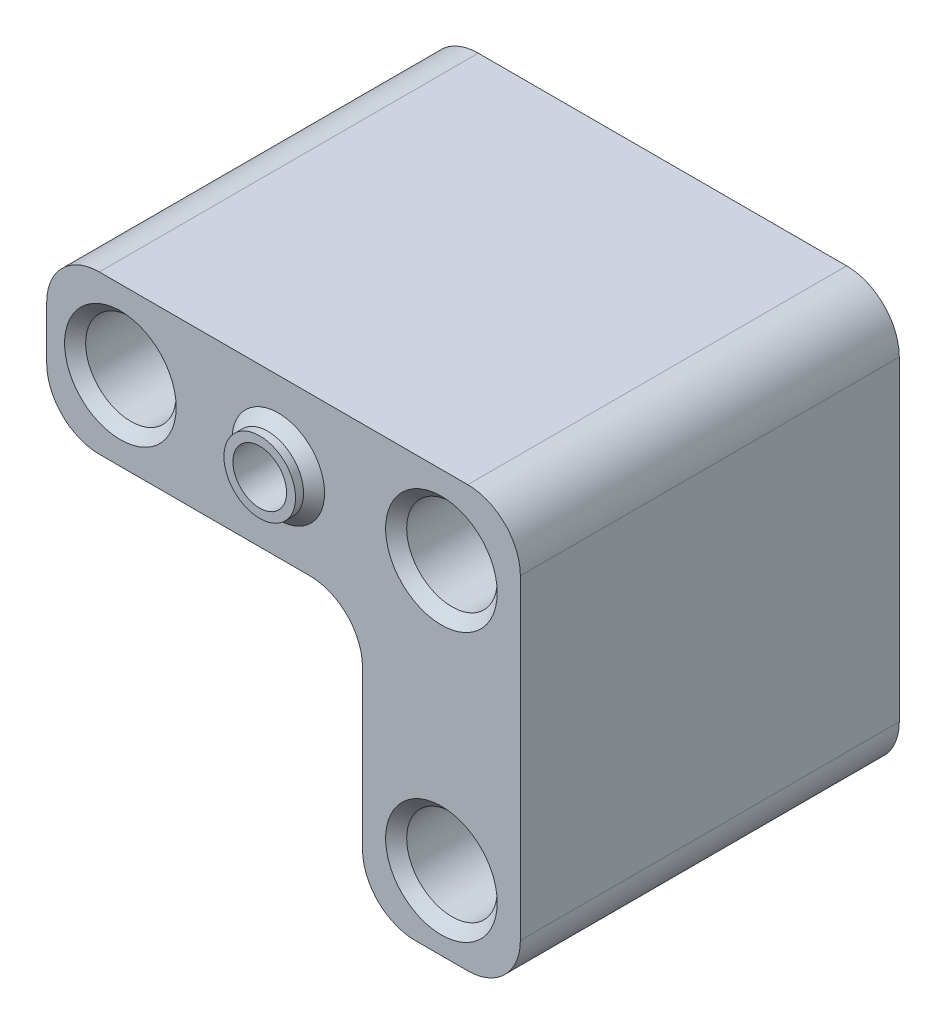
ISO-10303-21;
HEADER;
FILE_DESCRIPTION(('STEP AP214'),'2;1');
FILE_NAME('part.step','',(''),(''),'','','');
FILE_SCHEMA(('AUTOMOTIVE_DESIGN { 1 0 10303 214 1 1 1 1 }'));
ENDSEC;
DATA;
#1=APPLICATION_CONTEXT('core data for automotive mechanical design processes');
#2=APPLICATION_PROTOCOL_DEFINITION('international standard','automotive_design',2000,#1);
#3=PRODUCT_CONTEXT('',#1,'mechanical');
#4=PRODUCT('Part','Part','',(#3));
#5=PRODUCT_RELATED_PRODUCT_CATEGORY('part','',(#4));
#6=PRODUCT_DEFINITION_FORMATION('','',#4);
#7=PRODUCT_DEFINITION_CONTEXT('part definition',#1,'design');
#8=PRODUCT_DEFINITION('design','',#6,#7);
#9=PRODUCT_DEFINITION_SHAPE('','',#8);
#10=(LENGTH_UNIT() NAMED_UNIT(*) SI_UNIT(.MILLI.,.METRE.));
#11=(NAMED_UNIT(*) PLANE_ANGLE_UNIT() SI_UNIT($,.RADIAN.));
#12=(NAMED_UNIT(*) SI_UNIT($,.STERADIAN.) SOLID_ANGLE_UNIT());
#13=UNCERTAINTY_MEASURE_WITH_UNIT(LENGTH_MEASURE(1.E-05),#10,'distance_accuracy_value','');
#14=(GEOMETRIC_REPRESENTATION_CONTEXT(3) GLOBAL_UNCERTAINTY_ASSIGNED_CONTEXT((#13)) GLOBAL_UNIT_ASSIGNED_CONTEXT((#10,
#11,#12)) REPRESENTATION_CONTEXT('',''));
#15=CARTESIAN_POINT('',(0.,0.,0.));
#16=DIRECTION('',(0.,0.,1.));
#17=DIRECTION('',(1.,0.,0.));
#18=AXIS2_PLACEMENT_3D('',#15,#16,#17);
#19=CARTESIAN_POINT('',(-653.,0.,36.));
#20=DIRECTION('',(0.,0.,-1.));
#21=DIRECTION('',(1.,0.,0.));
#22=AXIS2_PLACEMENT_3D('',#19,#20,#21);
#23=PLANE('',#22);
#24=CARTESIAN_POINT('',(-349.5,352.5,36.));
#25=DIRECTION('',(0.,0.,1.));
#26=DIRECTION('',(1.,0.,0.));
#27=AXIS2_PLACEMENT_3D('',#24,#25,#26);
#28=CIRCLE('',#27,4.40000000000001);
#29=CARTESIAN_POINT('',(-345.1,352.5,36.));
#30=VERTEX_POINT('',#29);
#31=EDGE_CURVE('E538',#30,#30,#28,.T.);
#32=ORIENTED_EDGE('',*,*,#31,.F.);
#33=EDGE_LOOP('',(#32));
#34=FACE_BOUND('',#33,.T.);
#35=DIRECTION('',(0.,-1.,0.));
#36=VECTOR('',#35,1.);
#37=CARTESIAN_POINT('',(-371.5,360.,36.));
#38=LINE('',#37,#36);
#39=CARTESIAN_POINT('',(-371.5,355.,36.));
#40=VERTEX_POINT('',#39);
#41=CARTESIAN_POINT('',(-371.5,350.,36.));
#42=VERTEX_POINT('',#41);
#43=EDGE_CURVE('E403',#40,#42,#38,.T.);
#44=ORIENTED_EDGE('',*,*,#43,.T.);
#45=CARTESIAN_POINT('',(-366.5,350.,36.));
#46=DIRECTION('',(0.,0.,1.));
#47=DIRECTION('',(1.,0.,0.));
#48=AXIS2_PLACEMENT_3D('',#45,#46,#47);
#49=CIRCLE('',#48,5.);
#50=CARTESIAN_POINT('',(-366.5,345.,36.));
#51=VERTEX_POINT('',#50);
#52=EDGE_CURVE('E470',#51,#42,#49,.F.);
#53=ORIENTED_EDGE('',*,*,#52,.F.);
#54=DIRECTION('',(-1.,0.,0.));
#55=VECTOR('',#54,1.);
#56=CARTESIAN_POINT('',(-341.5,345.,36.));
#57=LINE('',#56,#55);
#58=CARTESIAN_POINT('',(-346.5,345.,36.));
#59=VERTEX_POINT('',#58);
#60=EDGE_CURVE('E360',#59,#51,#57,.T.);
#61=ORIENTED_EDGE('',*,*,#60,.F.);
#62=CARTESIAN_POINT('',(-346.5,340.,36.));
#63=DIRECTION('',(0.,0.,1.));
#64=DIRECTION('',(1.,0.,0.));
#65=AXIS2_PLACEMENT_3D('',#62,#63,#64);
#66=CIRCLE('',#65,5.);
#67=CARTESIAN_POINT('',(-341.5,340.,36.));
#68=VERTEX_POINT('',#67);
#69=EDGE_CURVE('E506',#68,#59,#66,.T.);
#70=ORIENTED_EDGE('',*,*,#69,.F.);
#71=DIRECTION('',(0.,1.,0.));
#72=VECTOR('',#71,1.);
#73=CARTESIAN_POINT('',(-341.5,320.,36.));
#74=LINE('',#73,#72);
#75=CARTESIAN_POINT('',(-341.5,325.,36.));
#76=VERTEX_POINT('',#75);
#77=EDGE_CURVE('E378',#76,#68,#74,.T.);
#78=ORIENTED_EDGE('',*,*,#77,.F.);
#79=CARTESIAN_POINT('',(-336.5,325.,36.));
#80=DIRECTION('',(0.,0.,1.));
#81=DIRECTION('',(1.,0.,0.));
#82=AXIS2_PLACEMENT_3D('',#79,#80,#81);
#83=CIRCLE('',#82,5.);
#84=CARTESIAN_POINT('',(-336.5,320.,36.));
#85=VERTEX_POINT('',#84);
#86=EDGE_CURVE('E466',#85,#76,#83,.F.);
#87=ORIENTED_EDGE('',*,*,#86,.F.);
#88=DIRECTION('',(1.,0.,0.));
#89=VECTOR('',#88,1.);
#90=CARTESIAN_POINT('',(-341.5,320.,36.));
#91=LINE('',#90,#89);
#92=CARTESIAN_POINT('',(-331.5,320.,36.));
#93=VERTEX_POINT('',#92);
#94=EDGE_CURVE('E374',#85,#93,#91,.T.);
#95=ORIENTED_EDGE('',*,*,#94,.T.);
#96=CARTESIAN_POINT('',(-331.5,325.,36.));
#97=DIRECTION('',(0.,0.,1.));
#98=DIRECTION('',(1.,0.,0.));
#99=AXIS2_PLACEMENT_3D('',#96,#97,#98);
#100=CIRCLE('',#99,5.);
#101=CARTESIAN_POINT('',(-326.5,325.,36.));
#102=VERTEX_POINT('',#101);
#103=EDGE_CURVE('E462',#102,#93,#100,.F.);
#104=ORIENTED_EDGE('',*,*,#103,.F.);
#105=DIRECTION('',(0.,1.,0.));
#106=VECTOR('',#105,1.);
#107=CARTESIAN_POINT('',(-326.5,320.,36.));
#108=LINE('',#107,#106);
#109=CARTESIAN_POINT('',(-326.5,355.,36.));
#110=VERTEX_POINT('',#109);
#111=EDGE_CURVE('E369',#102,#110,#108,.T.);
#112=ORIENTED_EDGE('',*,*,#111,.T.);
#113=CARTESIAN_POINT('',(-331.5,355.,36.));
#114=DIRECTION('',(0.,0.,1.));
#115=DIRECTION('',(1.,0.,0.));
#116=AXIS2_PLACEMENT_3D('',#113,#114,#115);
#117=CIRCLE('',#116,5.);
#118=CARTESIAN_POINT('',(-331.5,360.,36.));
#119=VERTEX_POINT('',#118);
#120=EDGE_CURVE('E458',#119,#110,#117,.F.);
#121=ORIENTED_EDGE('',*,*,#120,.F.);
#122=DIRECTION('',(1.,0.,0.));
#123=VECTOR('',#122,1.);
#124=CARTESIAN_POINT('',(-341.5,360.,36.));
#125=LINE('',#124,#123);
#126=CARTESIAN_POINT('',(-366.5,360.,36.));
#127=VERTEX_POINT('',#126);
#128=EDGE_CURVE('E365',#127,#119,#125,.T.);
#129=ORIENTED_EDGE('',*,*,#128,.F.);
#130=CARTESIAN_POINT('',(-366.5,355.,36.));
#131=DIRECTION('',(0.,0.,1.));
#132=DIRECTION('',(1.,0.,0.));
#133=AXIS2_PLACEMENT_3D('',#130,#131,#132);
#134=CIRCLE('',#133,5.);
#135=EDGE_CURVE('E474',#40,#127,#134,.F.);
#136=ORIENTED_EDGE('',*,*,#135,.F.);
#137=EDGE_LOOP('',(#44,#53,#61,#70,#78,#87,#95,#104,#112,#121,#129,#136));
#138=FACE_BOUND('',#137,.T.);
#139=CARTESIAN_POINT('',(-334.,327.,36.));
#140=DIRECTION('',(0.,0.,1.));
#141=DIRECTION('',(1.,0.,0.));
#142=AXIS2_PLACEMENT_3D('',#139,#140,#141);
#143=CIRCLE('',#142,5.30000000000003);
#144=CARTESIAN_POINT('',(-328.7,327.,36.));
#145=VERTEX_POINT('',#144);
#146=EDGE_CURVE('E514',#145,#145,#143,.T.);
#147=ORIENTED_EDGE('',*,*,#146,.F.);
#148=EDGE_LOOP('',(#147));
#149=FACE_BOUND('',#148,.T.);
#150=CARTESIAN_POINT('',(-334.,352.5,36.));
#151=DIRECTION('',(0.,0.,1.));
#152=DIRECTION('',(1.,0.,0.));
#153=AXIS2_PLACEMENT_3D('',#150,#151,#152);
#154=CIRCLE('',#153,5.30000000000003);
#155=CARTESIAN_POINT('',(-328.7,352.5,36.));
#156=VERTEX_POINT('',#155);
#157=EDGE_CURVE('E518',#156,#156,#154,.T.);
#158=ORIENTED_EDGE('',*,*,#157,.F.);
#159=EDGE_LOOP('',(#158));
#160=FACE_BOUND('',#159,.T.);
#161=CARTESIAN_POINT('',(-364.5,352.5,36.));
#162=DIRECTION('',(0.,0.,1.));
#163=DIRECTION('',(1.,0.,0.));
#164=AXIS2_PLACEMENT_3D('',#161,#162,#163);
#165=CIRCLE('',#164,5.30000000000003);
#166=CARTESIAN_POINT('',(-359.2,352.5,36.));
#167=VERTEX_POINT('',#166);
#168=EDGE_CURVE('E522',#167,#167,#165,.T.);
#169=ORIENTED_EDGE('',*,*,#168,.F.);
#170=EDGE_LOOP('',(#169));
#171=FACE_BOUND('',#170,.T.);
#172=ADVANCED_FACE('F137',(#34,#138,#149,#160,#171),#23,.F.);
#173=CARTESIAN_POINT('',(-334.,352.5,36.));
#174=DIRECTION('',(0.,0.,-1.));
#175=DIRECTION('',(1.,0.,0.));
#176=AXIS2_PLACEMENT_3D('',#173,#174,#175);
#177=CYLINDRICAL_SURFACE('',#176,2.55);
#178=CARTESIAN_POINT('',(-334.,352.5,0.));
#179=DIRECTION('',(0.,0.,-1.));
#180=DIRECTION('',(-1.,0.,0.));
#181=AXIS2_PLACEMENT_3D('',#178,#179,#180);
#182=CIRCLE('',#181,2.55);
#183=CARTESIAN_POINT('',(-336.55,352.5,0.));
#184=VERTEX_POINT('',#183);
#185=EDGE_CURVE('E359',#184,#184,#182,.T.);
#186=ORIENTED_EDGE('',*,*,#185,.T.);
#187=EDGE_LOOP('',(#186));
#188=FACE_BOUND('',#187,.T.);
#189=CARTESIAN_POINT('',(-334.,352.5,5.4));
#190=DIRECTION('',(0.,0.,-1.));
#191=DIRECTION('',(-1.,0.,0.));
#192=AXIS2_PLACEMENT_3D('',#189,#190,#191);
#193=CIRCLE('',#192,2.55);
#194=CARTESIAN_POINT('',(-336.55,352.5,5.4));
#195=VERTEX_POINT('',#194);
#196=EDGE_CURVE('E402',#195,#195,#193,.T.);
#197=ORIENTED_EDGE('',*,*,#196,.F.);
#198=EDGE_LOOP('',(#197));
#199=FACE_BOUND('',#198,.T.);
#200=ADVANCED_FACE('F632',(#188,#199),#177,.F.);
#201=CARTESIAN_POINT('',(-334.,327.,36.));
#202=DIRECTION('',(0.,0.,-1.));
#203=DIRECTION('',(1.,0.,0.));
#204=AXIS2_PLACEMENT_3D('',#201,#202,#203);
#205=CYLINDRICAL_SURFACE('',#204,2.55);
#206=CARTESIAN_POINT('',(-334.,327.,0.));
#207=DIRECTION('',(0.,0.,-1.));
#208=DIRECTION('',(-1.,0.,0.));
#209=AXIS2_PLACEMENT_3D('',#206,#207,#208);
#210=CIRCLE('',#209,2.55);
#211=CARTESIAN_POINT('',(-336.55,327.,0.));
#212=VERTEX_POINT('',#211);
#213=EDGE_CURVE('E355',#212,#212,#210,.T.);
#214=ORIENTED_EDGE('',*,*,#213,.T.);
#215=EDGE_LOOP('',(#214));
#216=FACE_BOUND('',#215,.T.);
#217=CARTESIAN_POINT('',(-334.,327.,5.4));
#218=DIRECTION('',(0.,0.,-1.));
#219=DIRECTION('',(-1.,0.,0.));
#220=AXIS2_PLACEMENT_3D('',#217,#218,#219);
#221=CIRCLE('',#220,2.55);
#222=CARTESIAN_POINT('',(-336.55,327.,5.4));
#223=VERTEX_POINT('',#222);
#224=EDGE_CURVE('E420',#223,#223,#221,.T.);
#225=ORIENTED_EDGE('',*,*,#224,.F.);
#226=EDGE_LOOP('',(#225));
#227=FACE_BOUND('',#226,.T.);
#228=ADVANCED_FACE('F638',(#216,#227),#205,.F.);
#229=CARTESIAN_POINT('',(-364.5,352.5,36.));
#230=DIRECTION('',(0.,0.,-1.));
#231=DIRECTION('',(1.,0.,0.));
#232=AXIS2_PLACEMENT_3D('',#229,#230,#231);
#233=CYLINDRICAL_SURFACE('',#232,2.55);
#234=CARTESIAN_POINT('',(-364.5,352.5,0.));
#235=DIRECTION('',(0.,0.,-1.));
#236=DIRECTION('',(-1.,0.,0.));
#237=AXIS2_PLACEMENT_3D('',#234,#235,#236);
#238=CIRCLE('',#237,2.55);
#239=CARTESIAN_POINT('',(-367.05,352.5,0.));
#240=VERTEX_POINT('',#239);
#241=EDGE_CURVE('E397',#240,#240,#238,.T.);
#242=ORIENTED_EDGE('',*,*,#241,.T.);
#243=EDGE_LOOP('',(#242));
#244=FACE_BOUND('',#243,.T.);
#245=CARTESIAN_POINT('',(-364.5,352.5,5.4));
#246=DIRECTION('',(0.,0.,-1.));
#247=DIRECTION('',(-1.,0.,0.));
#248=AXIS2_PLACEMENT_3D('',#245,#246,#247);
#249=CIRCLE('',#248,2.55);
#250=CARTESIAN_POINT('',(-367.05,352.5,5.4));
#251=VERTEX_POINT('',#250);
#252=EDGE_CURVE('E354',#251,#251,#249,.T.);
#253=ORIENTED_EDGE('',*,*,#252,.F.);
#254=EDGE_LOOP('',(#253));
#255=FACE_BOUND('',#254,.T.);
#256=ADVANCED_FACE('F653',(#244,#255),#233,.F.);
#257=CARTESIAN_POINT('',(-341.5,320.,36.));
#258=DIRECTION('',(1.,0.,0.));
#259=DIRECTION('',(0.,0.,1.));
#260=AXIS2_PLACEMENT_3D('',#257,#258,#259);
#261=PLANE('',#260);
#262=DIRECTION('',(0.,1.,0.));
#263=VECTOR('',#262,1.);
#264=CARTESIAN_POINT('',(-341.5,320.,0.));
#265=LINE('',#264,#263);
#266=CARTESIAN_POINT('',(-341.5,325.,0.));
#267=VERTEX_POINT('',#266);
#268=CARTESIAN_POINT('',(-341.5,340.,0.));
#269=VERTEX_POINT('',#268);
#270=EDGE_CURVE('E370',#267,#269,#265,.T.);
#271=ORIENTED_EDGE('',*,*,#270,.F.);
#272=DIRECTION('',(0.,0.,-1.));
#273=VECTOR('',#272,1.);
#274=CARTESIAN_POINT('',(-341.5,325.,0.));
#275=LINE('',#274,#273);
#276=EDGE_CURVE('E484',#76,#267,#275,.T.);
#277=ORIENTED_EDGE('',*,*,#276,.F.);
#278=ORIENTED_EDGE('',*,*,#77,.T.);
#279=DIRECTION('',(0.,0.,-1.));
#280=VECTOR('',#279,1.);
#281=CARTESIAN_POINT('',(-341.5,340.,36.));
#282=LINE('',#281,#280);
#283=EDGE_CURVE('E488',#269,#68,#282,.F.);
#284=ORIENTED_EDGE('',*,*,#283,.F.);
#285=EDGE_LOOP('',(#271,#277,#278,#284));
#286=FACE_BOUND('',#285,.T.);
#287=ADVANCED_FACE('F649',(#286),#261,.F.);
#288=CARTESIAN_POINT('',(-653.,0.,0.));
#289=DIRECTION('',(0.,0.,-1.));
#290=DIRECTION('',(1.,0.,0.));
#291=AXIS2_PLACEMENT_3D('',#288,#289,#290);
#292=PLANE('',#291);
#293=DIRECTION('',(0.,-1.,0.));
#294=VECTOR('',#293,1.);
#295=CARTESIAN_POINT('',(-354.55,350.161731409782,0.));
#296=LINE('',#295,#294);
#297=CARTESIAN_POINT('',(-354.55,355.415618859408,0.));
#298=VERTEX_POINT('',#297);
#299=CARTESIAN_POINT('',(-354.55,349.584381140593,0.));
#300=VERTEX_POINT('',#299);
#301=EDGE_CURVE('E554',#298,#300,#296,.T.);
#302=ORIENTED_EDGE('',*,*,#301,.T.);
#303=DIRECTION('',(0.866025403784436,-0.500000000000004,0.));
#304=VECTOR('',#303,1.);
#305=CARTESIAN_POINT('',(-350.,346.95743741578,0.));
#306=LINE('',#305,#304);
#307=CARTESIAN_POINT('',(-349.5,346.668762281185,0.));
#308=VERTEX_POINT('',#307);
#309=EDGE_CURVE('E557',#300,#308,#306,.T.);
#310=ORIENTED_EDGE('',*,*,#309,.T.);
#311=DIRECTION('',(0.866025403784438,0.5,0.));
#312=VECTOR('',#311,1.);
#313=CARTESIAN_POINT('',(-344.95,349.295706005998,0.));
#314=LINE('',#313,#312);
#315=CARTESIAN_POINT('',(-344.45,349.584381140592,0.));
#316=VERTEX_POINT('',#315);
#317=EDGE_CURVE('E542',#308,#316,#314,.T.);
#318=ORIENTED_EDGE('',*,*,#317,.T.);
#319=DIRECTION('',(0.,1.,0.));
#320=VECTOR('',#319,1.);
#321=CARTESIAN_POINT('',(-344.45,354.838268590218,0.));
#322=LINE('',#321,#320);
#323=CARTESIAN_POINT('',(-344.45,355.415618859408,0.));
#324=VERTEX_POINT('',#323);
#325=EDGE_CURVE('E545',#316,#324,#322,.T.);
#326=ORIENTED_EDGE('',*,*,#325,.T.);
#327=DIRECTION('',(-0.866025403784439,0.499999999999999,0.));
#328=VECTOR('',#327,1.);
#329=CARTESIAN_POINT('',(-349.,358.04256258422,0.));
#330=LINE('',#329,#328);
#331=CARTESIAN_POINT('',(-349.5,358.331237718815,0.));
#332=VERTEX_POINT('',#331);
#333=EDGE_CURVE('E548',#324,#332,#330,.T.);
#334=ORIENTED_EDGE('',*,*,#333,.T.);
#335=DIRECTION('',(-0.866025403784436,-0.500000000000006,0.));
#336=VECTOR('',#335,1.);
#337=CARTESIAN_POINT('',(-354.05,355.704293994003,0.));
#338=LINE('',#337,#336);
#339=EDGE_CURVE('E551',#332,#298,#338,.T.);
#340=ORIENTED_EDGE('',*,*,#339,.T.);
#341=EDGE_LOOP('',(#302,#310,#318,#326,#334,#340));
#342=FACE_BOUND('',#341,.T.);
#343=ORIENTED_EDGE('',*,*,#185,.F.);
#344=EDGE_LOOP('',(#343));
#345=FACE_BOUND('',#344,.T.);
#346=DIRECTION('',(1.,0.,0.));
#347=VECTOR('',#346,1.);
#348=CARTESIAN_POINT('',(-341.5,360.,0.));
#349=LINE('',#348,#347);
#350=CARTESIAN_POINT('',(-366.5,360.,0.));
#351=VERTEX_POINT('',#350);
#352=CARTESIAN_POINT('',(-331.5,360.,0.));
#353=VERTEX_POINT('',#352);
#354=EDGE_CURVE('E364',#351,#353,#349,.T.);
#355=ORIENTED_EDGE('',*,*,#354,.T.);
#356=CARTESIAN_POINT('',(-331.5,355.,0.));
#357=DIRECTION('',(0.,0.,1.));
#358=DIRECTION('',(1.,0.,0.));
#359=AXIS2_PLACEMENT_3D('',#356,#357,#358);
#360=CIRCLE('',#359,5.);
#361=CARTESIAN_POINT('',(-326.5,355.,0.));
#362=VERTEX_POINT('',#361);
#363=EDGE_CURVE('E432',#362,#353,#360,.T.);
#364=ORIENTED_EDGE('',*,*,#363,.F.);
#365=DIRECTION('',(0.,1.,0.));
#366=VECTOR('',#365,1.);
#367=CARTESIAN_POINT('',(-326.5,320.,0.));
#368=LINE('',#367,#366);
#369=CARTESIAN_POINT('',(-326.5,325.,0.));
#370=VERTEX_POINT('',#369);
#371=EDGE_CURVE('E386',#370,#362,#368,.T.);
#372=ORIENTED_EDGE('',*,*,#371,.F.);
#373=CARTESIAN_POINT('',(-331.5,325.,0.));
#374=DIRECTION('',(0.,0.,1.));
#375=DIRECTION('',(1.,0.,0.));
#376=AXIS2_PLACEMENT_3D('',#373,#374,#375);
#377=CIRCLE('',#376,5.);
#378=CARTESIAN_POINT('',(-331.5,320.,0.));
#379=VERTEX_POINT('',#378);
#380=EDGE_CURVE('E436',#379,#370,#377,.T.);
#381=ORIENTED_EDGE('',*,*,#380,.F.);
#382=DIRECTION('',(1.,0.,0.));
#383=VECTOR('',#382,1.);
#384=CARTESIAN_POINT('',(-341.5,320.,0.));
#385=LINE('',#384,#383);
#386=CARTESIAN_POINT('',(-336.5,320.,0.));
#387=VERTEX_POINT('',#386);
#388=EDGE_CURVE('E390',#387,#379,#385,.T.);
#389=ORIENTED_EDGE('',*,*,#388,.F.);
#390=CARTESIAN_POINT('',(-336.5,325.,0.));
#391=DIRECTION('',(0.,0.,1.));
#392=DIRECTION('',(1.,0.,0.));
#393=AXIS2_PLACEMENT_3D('',#390,#391,#392);
#394=CIRCLE('',#393,5.);
#395=EDGE_CURVE('E440',#267,#387,#394,.T.);
#396=ORIENTED_EDGE('',*,*,#395,.F.);
#397=ORIENTED_EDGE('',*,*,#270,.T.);
#398=CARTESIAN_POINT('',(-346.5,340.,0.));
#399=DIRECTION('',(0.,0.,1.));
#400=DIRECTION('',(1.,0.,0.));
#401=AXIS2_PLACEMENT_3D('',#398,#399,#400);
#402=CIRCLE('',#401,5.);
#403=CARTESIAN_POINT('',(-346.5,345.,0.));
#404=VERTEX_POINT('',#403);
#405=EDGE_CURVE('E503',#404,#269,#402,.F.);
#406=ORIENTED_EDGE('',*,*,#405,.F.);
#407=DIRECTION('',(-1.,0.,0.));
#408=VECTOR('',#407,1.);
#409=CARTESIAN_POINT('',(-341.5,345.,0.));
#410=LINE('',#409,#408);
#411=CARTESIAN_POINT('',(-366.5,345.,0.));
#412=VERTEX_POINT('',#411);
#413=EDGE_CURVE('E407',#404,#412,#410,.T.);
#414=ORIENTED_EDGE('',*,*,#413,.T.);
#415=CARTESIAN_POINT('',(-366.5,350.,0.));
#416=DIRECTION('',(0.,0.,1.));
#417=DIRECTION('',(1.,0.,0.));
#418=AXIS2_PLACEMENT_3D('',#415,#416,#417);
#419=CIRCLE('',#418,5.);
#420=CARTESIAN_POINT('',(-371.5,350.,0.));
#421=VERTEX_POINT('',#420);
#422=EDGE_CURVE('E444',#421,#412,#419,.T.);
#423=ORIENTED_EDGE('',*,*,#422,.F.);
#424=DIRECTION('',(0.,-1.,0.));
#425=VECTOR('',#424,1.);
#426=CARTESIAN_POINT('',(-371.5,360.,0.));
#427=LINE('',#426,#425);
#428=CARTESIAN_POINT('',(-371.5,355.,0.));
#429=VERTEX_POINT('',#428);
#430=EDGE_CURVE('E401',#429,#421,#427,.T.);
#431=ORIENTED_EDGE('',*,*,#430,.F.);
#432=CARTESIAN_POINT('',(-366.5,355.,0.));
#433=DIRECTION('',(0.,0.,1.));
#434=DIRECTION('',(1.,0.,0.));
#435=AXIS2_PLACEMENT_3D('',#432,#433,#434);
#436=CIRCLE('',#435,5.);
#437=EDGE_CURVE('E448',#351,#429,#436,.T.);
#438=ORIENTED_EDGE('',*,*,#437,.F.);
#439=EDGE_LOOP('',(#355,#364,#372,#381,#389,#396,#397,#406,#414,#423,#431,#438));
#440=FACE_BOUND('',#439,.T.);
#441=ORIENTED_EDGE('',*,*,#213,.F.);
#442=EDGE_LOOP('',(#441));
#443=FACE_BOUND('',#442,.T.);
#444=ORIENTED_EDGE('',*,*,#241,.F.);
#445=EDGE_LOOP('',(#444));
#446=FACE_BOUND('',#445,.T.);
#447=ADVANCED_FACE('F645',(#342,#345,#440,#443,#446),#292,.T.);
#448=CARTESIAN_POINT('',(-341.5,360.,36.));
#449=DIRECTION('',(0.,-1.,0.));
#450=DIRECTION('',(0.,0.,-1.));
#451=AXIS2_PLACEMENT_3D('',#448,#449,#450);
#452=PLANE('',#451);
#453=ORIENTED_EDGE('',*,*,#128,.T.);
#454=DIRECTION('',(0.,0.,-1.));
#455=VECTOR('',#454,1.);
#456=CARTESIAN_POINT('',(-331.5,360.,36.));
#457=LINE('',#456,#455);
#458=EDGE_CURVE('E382',#353,#119,#457,.F.);
#459=ORIENTED_EDGE('',*,*,#458,.F.);
#460=ORIENTED_EDGE('',*,*,#354,.F.);
#461=DIRECTION('',(0.,0.,-1.));
#462=VECTOR('',#461,1.);
#463=CARTESIAN_POINT('',(-366.5,360.,0.));
#464=LINE('',#463,#462);
#465=EDGE_CURVE('E429',#127,#351,#464,.T.);
#466=ORIENTED_EDGE('',*,*,#465,.F.);
#467=EDGE_LOOP('',(#453,#459,#460,#466));
#468=FACE_BOUND('',#467,.T.);
#469=ADVANCED_FACE('F648',(#468),#452,.F.);
#470=CARTESIAN_POINT('',(-326.5,320.,36.));
#471=DIRECTION('',(1.,0.,0.));
#472=DIRECTION('',(0.,0.,1.));
#473=AXIS2_PLACEMENT_3D('',#470,#471,#472);
#474=PLANE('',#473);
#475=ORIENTED_EDGE('',*,*,#371,.T.);
#476=DIRECTION('',(0.,0.,-1.));
#477=VECTOR('',#476,1.);
#478=CARTESIAN_POINT('',(-326.5,355.,0.));
#479=LINE('',#478,#477);
#480=EDGE_CURVE('E497',#110,#362,#479,.T.);
#481=ORIENTED_EDGE('',*,*,#480,.F.);
#482=ORIENTED_EDGE('',*,*,#111,.F.);
#483=DIRECTION('',(0.,0.,-1.));
#484=VECTOR('',#483,1.);
#485=CARTESIAN_POINT('',(-326.5,325.,36.));
#486=LINE('',#485,#484);
#487=EDGE_CURVE('E500',#370,#102,#486,.F.);
#488=ORIENTED_EDGE('',*,*,#487,.F.);
#489=EDGE_LOOP('',(#475,#481,#482,#488));
#490=FACE_BOUND('',#489,.T.);
#491=ADVANCED_FACE('F659',(#490),#474,.T.);
#492=CARTESIAN_POINT('',(-341.5,320.,36.));
#493=DIRECTION('',(0.,-1.,0.));
#494=DIRECTION('',(0.,0.,-1.));
#495=AXIS2_PLACEMENT_3D('',#492,#493,#494);
#496=PLANE('',#495);
#497=ORIENTED_EDGE('',*,*,#388,.T.);
#498=DIRECTION('',(0.,0.,-1.));
#499=VECTOR('',#498,1.);
#500=CARTESIAN_POINT('',(-331.5,320.,36.));
#501=LINE('',#500,#499);
#502=EDGE_CURVE('E491',#93,#379,#501,.T.);
#503=ORIENTED_EDGE('',*,*,#502,.F.);
#504=ORIENTED_EDGE('',*,*,#94,.F.);
#505=DIRECTION('',(0.,0.,-1.));
#506=VECTOR('',#505,1.);
#507=CARTESIAN_POINT('',(-336.5,320.,36.));
#508=LINE('',#507,#506);
#509=EDGE_CURVE('E494',#387,#85,#508,.F.);
#510=ORIENTED_EDGE('',*,*,#509,.F.);
#511=EDGE_LOOP('',(#497,#503,#504,#510));
#512=FACE_BOUND('',#511,.T.);
#513=ADVANCED_FACE('F655',(#512),#496,.T.);
#514=CARTESIAN_POINT('',(-371.5,360.,36.));
#515=DIRECTION('',(-1.,0.,0.));
#516=DIRECTION('',(0.,0.,-1.));
#517=AXIS2_PLACEMENT_3D('',#514,#515,#516);
#518=PLANE('',#517);
#519=ORIENTED_EDGE('',*,*,#430,.T.);
#520=DIRECTION('',(0.,0.,-1.));
#521=VECTOR('',#520,1.);
#522=CARTESIAN_POINT('',(-371.5,350.,0.));
#523=LINE('',#522,#521);
#524=EDGE_CURVE('E452',#42,#421,#523,.T.);
#525=ORIENTED_EDGE('',*,*,#524,.F.);
#526=ORIENTED_EDGE('',*,*,#43,.F.);
#527=DIRECTION('',(0.,0.,-1.));
#528=VECTOR('',#527,1.);
#529=CARTESIAN_POINT('',(-371.5,355.,36.));
#530=LINE('',#529,#528);
#531=EDGE_CURVE('E455',#429,#40,#530,.F.);
#532=ORIENTED_EDGE('',*,*,#531,.F.);
#533=EDGE_LOOP('',(#519,#525,#526,#532));
#534=FACE_BOUND('',#533,.T.);
#535=ADVANCED_FACE('F658',(#534),#518,.T.);
#536=CARTESIAN_POINT('',(-341.5,345.,36.));
#537=DIRECTION('',(0.,1.,0.));
#538=DIRECTION('',(0.,0.,1.));
#539=AXIS2_PLACEMENT_3D('',#536,#537,#538);
#540=PLANE('',#539);
#541=ORIENTED_EDGE('',*,*,#413,.F.);
#542=DIRECTION('',(0.,0.,-1.));
#543=VECTOR('',#542,1.);
#544=CARTESIAN_POINT('',(-346.5,345.,0.));
#545=LINE('',#544,#543);
#546=EDGE_CURVE('E478',#59,#404,#545,.T.);
#547=ORIENTED_EDGE('',*,*,#546,.F.);
#548=ORIENTED_EDGE('',*,*,#60,.T.);
#549=DIRECTION('',(0.,0.,-1.));
#550=VECTOR('',#549,1.);
#551=CARTESIAN_POINT('',(-366.5,345.,36.));
#552=LINE('',#551,#550);
#553=EDGE_CURVE('E481',#412,#51,#552,.F.);
#554=ORIENTED_EDGE('',*,*,#553,.F.);
#555=EDGE_LOOP('',(#541,#547,#548,#554));
#556=FACE_BOUND('',#555,.T.);
#557=ADVANCED_FACE('F670',(#556),#540,.F.);
#558=CARTESIAN_POINT('',(-364.5,352.5,5.4));
#559=DIRECTION('',(0.,0.,1.));
#560=DIRECTION('',(-1.,0.,0.));
#561=AXIS2_PLACEMENT_3D('',#558,#559,#560);
#562=CYLINDRICAL_SURFACE('',#561,4.30000000000004);
#563=CARTESIAN_POINT('',(-364.5,352.5,35.));
#564=DIRECTION('',(0.,0.,1.));
#565=DIRECTION('',(1.,0.,0.));
#566=AXIS2_PLACEMENT_3D('',#563,#564,#565);
#567=CIRCLE('',#566,4.30000000000004);
#568=CARTESIAN_POINT('',(-360.2,352.5,35.));
#569=VERTEX_POINT('',#568);
#570=EDGE_CURVE('E510',#569,#569,#567,.F.);
#571=ORIENTED_EDGE('',*,*,#570,.F.);
#572=EDGE_LOOP('',(#571));
#573=FACE_BOUND('',#572,.T.);
#574=CARTESIAN_POINT('',(-364.5,352.5,5.4));
#575=DIRECTION('',(0.,0.,-1.));
#576=DIRECTION('',(-1.,0.,0.));
#577=AXIS2_PLACEMENT_3D('',#574,#575,#576);
#578=CIRCLE('',#577,4.30000000000004);
#579=CARTESIAN_POINT('',(-368.8,352.5,5.4));
#580=VERTEX_POINT('',#579);
#581=EDGE_CURVE('E330',#580,#580,#578,.T.);
#582=ORIENTED_EDGE('',*,*,#581,.T.);
#583=EDGE_LOOP('',(#582));
#584=FACE_BOUND('',#583,.T.);
#585=ADVANCED_FACE('F673',(#573,#584),#562,.F.);
#586=CARTESIAN_POINT('',(-364.5,352.5,5.4));
#587=DIRECTION('',(0.,0.,1.));
#588=DIRECTION('',(-1.,0.,0.));
#589=AXIS2_PLACEMENT_3D('',#586,#587,#588);
#590=PLANE('',#589);
#591=ORIENTED_EDGE('',*,*,#252,.T.);
#592=EDGE_LOOP('',(#591));
#593=FACE_BOUND('',#592,.T.);
#594=ORIENTED_EDGE('',*,*,#581,.F.);
#595=EDGE_LOOP('',(#594));
#596=FACE_BOUND('',#595,.T.);
#597=ADVANCED_FACE('F785',(#593,#596),#590,.T.);
#598=CARTESIAN_POINT('',(-334.,327.,5.4));
#599=DIRECTION('',(0.,0.,1.));
#600=DIRECTION('',(-1.,0.,0.));
#601=AXIS2_PLACEMENT_3D('',#598,#599,#600);
#602=CYLINDRICAL_SURFACE('',#601,4.30000000000004);
#603=CARTESIAN_POINT('',(-334.,327.,35.));
#604=DIRECTION('',(0.,0.,1.));
#605=DIRECTION('',(1.,0.,0.));
#606=AXIS2_PLACEMENT_3D('',#603,#604,#605);
#607=CIRCLE('',#606,4.30000000000004);
#608=CARTESIAN_POINT('',(-329.7,327.,35.));
#609=VERTEX_POINT('',#608);
#610=EDGE_CURVE('E530',#609,#609,#607,.F.);
#611=ORIENTED_EDGE('',*,*,#610,.F.);
#612=EDGE_LOOP('',(#611));
#613=FACE_BOUND('',#612,.T.);
#614=CARTESIAN_POINT('',(-334.,327.,5.4));
#615=DIRECTION('',(0.,0.,-1.));
#616=DIRECTION('',(-1.,0.,0.));
#617=AXIS2_PLACEMENT_3D('',#614,#615,#616);
#618=CIRCLE('',#617,4.30000000000004);
#619=CARTESIAN_POINT('',(-338.3,327.,5.4));
#620=VERTEX_POINT('',#619);
#621=EDGE_CURVE('E343',#620,#620,#618,.T.);
#622=ORIENTED_EDGE('',*,*,#621,.T.);
#623=EDGE_LOOP('',(#622));
#624=FACE_BOUND('',#623,.T.);
#625=ADVANCED_FACE('F781',(#613,#624),#602,.F.);
#626=CARTESIAN_POINT('',(-334.,327.,5.4));
#627=DIRECTION('',(0.,0.,1.));
#628=DIRECTION('',(-1.,0.,0.));
#629=AXIS2_PLACEMENT_3D('',#626,#627,#628);
#630=PLANE('',#629);
#631=ORIENTED_EDGE('',*,*,#224,.T.);
#632=EDGE_LOOP('',(#631));
#633=FACE_BOUND('',#632,.T.);
#634=ORIENTED_EDGE('',*,*,#621,.F.);
#635=EDGE_LOOP('',(#634));
#636=FACE_BOUND('',#635,.T.);
#637=ADVANCED_FACE('F784',(#633,#636),#630,.T.);
#638=CARTESIAN_POINT('',(-334.,352.5,5.4));
#639=DIRECTION('',(0.,0.,1.));
#640=DIRECTION('',(-1.,0.,0.));
#641=AXIS2_PLACEMENT_3D('',#638,#639,#640);
#642=CYLINDRICAL_SURFACE('',#641,4.30000000000004);
#643=CARTESIAN_POINT('',(-334.,352.5,35.));
#644=DIRECTION('',(0.,0.,1.));
#645=DIRECTION('',(1.,0.,0.));
#646=AXIS2_PLACEMENT_3D('',#643,#644,#645);
#647=CIRCLE('',#646,4.30000000000004);
#648=CARTESIAN_POINT('',(-329.7,352.5,35.));
#649=VERTEX_POINT('',#648);
#650=EDGE_CURVE('E526',#649,#649,#647,.F.);
#651=ORIENTED_EDGE('',*,*,#650,.F.);
#652=EDGE_LOOP('',(#651));
#653=FACE_BOUND('',#652,.T.);
#654=CARTESIAN_POINT('',(-334.,352.5,5.4));
#655=DIRECTION('',(0.,0.,-1.));
#656=DIRECTION('',(-1.,0.,0.));
#657=AXIS2_PLACEMENT_3D('',#654,#655,#656);
#658=CIRCLE('',#657,4.30000000000004);
#659=CARTESIAN_POINT('',(-338.3,352.5,5.4));
#660=VERTEX_POINT('',#659);
#661=EDGE_CURVE('E347',#660,#660,#658,.T.);
#662=ORIENTED_EDGE('',*,*,#661,.T.);
#663=EDGE_LOOP('',(#662));
#664=FACE_BOUND('',#663,.T.);
#665=ADVANCED_FACE('F789',(#653,#664),#642,.F.);
#666=CARTESIAN_POINT('',(-334.,352.5,5.4));
#667=DIRECTION('',(0.,0.,1.));
#668=DIRECTION('',(-1.,0.,0.));
#669=AXIS2_PLACEMENT_3D('',#666,#667,#668);
#670=PLANE('',#669);
#671=ORIENTED_EDGE('',*,*,#196,.T.);
#672=EDGE_LOOP('',(#671));
#673=FACE_BOUND('',#672,.T.);
#674=ORIENTED_EDGE('',*,*,#661,.F.);
#675=EDGE_LOOP('',(#674));
#676=FACE_BOUND('',#675,.T.);
#677=ADVANCED_FACE('F797',(#673,#676),#670,.T.);
#678=CARTESIAN_POINT('',(-349.5,352.5,31.6));
#679=DIRECTION('',(0.,0.,-1.));
#680=DIRECTION('',(1.,0.,0.));
#681=AXIS2_PLACEMENT_3D('',#678,#679,#680);
#682=PLANE('',#681);
#683=CARTESIAN_POINT('',(-349.5,352.5,31.6));
#684=DIRECTION('',(0.,0.,1.));
#685=DIRECTION('',(1.,0.,0.));
#686=AXIS2_PLACEMENT_3D('',#683,#684,#685);
#687=CIRCLE('',#686,2.55);
#688=CARTESIAN_POINT('',(-346.95,352.5,31.6));
#689=VERTEX_POINT('',#688);
#690=EDGE_CURVE('E306',#689,#689,#687,.T.);
#691=ORIENTED_EDGE('',*,*,#690,.T.);
#692=EDGE_LOOP('',(#691));
#693=FACE_BOUND('',#692,.T.);
#694=DIRECTION('',(-0.866025403784439,0.499999999999999,0.));
#695=VECTOR('',#694,1.);
#696=CARTESIAN_POINT('',(-345.45,354.838268590218,31.6));
#697=LINE('',#696,#695);
#698=CARTESIAN_POINT('',(-345.45,354.838268590218,31.6));
#699=VERTEX_POINT('',#698);
#700=CARTESIAN_POINT('',(-349.5,357.176537180436,31.6));
#701=VERTEX_POINT('',#700);
#702=EDGE_CURVE('E296',#699,#701,#697,.T.);
#703=ORIENTED_EDGE('',*,*,#702,.F.);
#704=DIRECTION('',(0.,1.,0.));
#705=VECTOR('',#704,1.);
#706=CARTESIAN_POINT('',(-345.45,350.161731409782,31.6));
#707=LINE('',#706,#705);
#708=CARTESIAN_POINT('',(-345.45,350.161731409782,31.6));
#709=VERTEX_POINT('',#708);
#710=EDGE_CURVE('E322',#709,#699,#707,.T.);
#711=ORIENTED_EDGE('',*,*,#710,.F.);
#712=DIRECTION('',(0.866025403784438,0.5,0.));
#713=VECTOR('',#712,1.);
#714=CARTESIAN_POINT('',(-349.5,347.823462819564,31.6));
#715=LINE('',#714,#713);
#716=CARTESIAN_POINT('',(-349.5,347.823462819564,31.6));
#717=VERTEX_POINT('',#716);
#718=EDGE_CURVE('E315',#717,#709,#715,.T.);
#719=ORIENTED_EDGE('',*,*,#718,.F.);
#720=DIRECTION('',(0.866025403784436,-0.500000000000004,0.));
#721=VECTOR('',#720,1.);
#722=CARTESIAN_POINT('',(-353.55,350.161731409782,31.6));
#723=LINE('',#722,#721);
#724=CARTESIAN_POINT('',(-353.55,350.161731409782,31.6));
#725=VERTEX_POINT('',#724);
#726=EDGE_CURVE('E311',#725,#717,#723,.T.);
#727=ORIENTED_EDGE('',*,*,#726,.F.);
#728=DIRECTION('',(0.,-1.,0.));
#729=VECTOR('',#728,1.);
#730=CARTESIAN_POINT('',(-353.55,354.838268590218,31.6));
#731=LINE('',#730,#729);
#732=CARTESIAN_POINT('',(-353.55,354.838268590218,31.6));
#733=VERTEX_POINT('',#732);
#734=EDGE_CURVE('E288',#733,#725,#731,.T.);
#735=ORIENTED_EDGE('',*,*,#734,.F.);
#736=DIRECTION('',(-0.866025403784435,-0.500000000000006,0.));
#737=VECTOR('',#736,1.);
#738=CARTESIAN_POINT('',(-349.5,357.176537180436,31.6));
#739=LINE('',#738,#737);
#740=EDGE_CURVE('E299',#701,#733,#739,.T.);
#741=ORIENTED_EDGE('',*,*,#740,.F.);
#742=EDGE_LOOP('',(#703,#711,#719,#727,#735,#741));
#743=FACE_BOUND('',#742,.T.);
#744=ADVANCED_FACE('F308',(#693,#743),#682,.T.);
#745=CARTESIAN_POINT('',(-345.45,354.838268590218,31.6));
#746=DIRECTION('',(0.499999999999999,0.866025403784439,0.));
#747=DIRECTION('',(0.866025403784439,-0.499999999999999,0.));
#748=AXIS2_PLACEMENT_3D('',#745,#746,#747);
#749=PLANE('',#748);
#750=DIRECTION('',(0.,0.,-1.));
#751=VECTOR('',#750,1.);
#752=CARTESIAN_POINT('',(-349.5,357.176537180436,31.6));
#753=LINE('',#752,#751);
#754=CARTESIAN_POINT('',(-349.5,357.176537180436,1.00000000000003));
#755=VERTEX_POINT('',#754);
#756=EDGE_CURVE('E301',#701,#755,#753,.T.);
#757=ORIENTED_EDGE('',*,*,#756,.T.);
#758=DIRECTION('',(0.866025403784439,-0.499999999999999,0.));
#759=VECTOR('',#758,1.);
#760=CARTESIAN_POINT('',(-345.45,354.838268590218,1.00000000000003));
#761=LINE('',#760,#759);
#762=CARTESIAN_POINT('',(-345.45,354.838268590218,1.00000000000002));
#763=VERTEX_POINT('',#762);
#764=EDGE_CURVE('E163',#755,#763,#761,.T.);
#765=ORIENTED_EDGE('',*,*,#764,.T.);
#766=DIRECTION('',(0.,0.,-1.));
#767=VECTOR('',#766,1.);
#768=CARTESIAN_POINT('',(-345.45,354.838268590218,31.6));
#769=LINE('',#768,#767);
#770=EDGE_CURVE('E331',#699,#763,#769,.T.);
#771=ORIENTED_EDGE('',*,*,#770,.F.);
#772=ORIENTED_EDGE('',*,*,#702,.T.);
#773=EDGE_LOOP('',(#757,#765,#771,#772));
#774=FACE_BOUND('',#773,.T.);
#775=ADVANCED_FACE('F766',(#774),#749,.F.);
#776=CARTESIAN_POINT('',(-349.5,357.176537180436,31.6));
#777=DIRECTION('',(-0.500000000000006,0.866025403784435,0.));
#778=DIRECTION('',(0.866025403784435,0.500000000000006,0.));
#779=AXIS2_PLACEMENT_3D('',#776,#777,#778);
#780=PLANE('',#779);
#781=DIRECTION('',(0.,0.,-1.));
#782=VECTOR('',#781,1.);
#783=CARTESIAN_POINT('',(-353.55,354.838268590218,31.6));
#784=LINE('',#783,#782);
#785=CARTESIAN_POINT('',(-353.55,354.838268590218,0.99999999999998));
#786=VERTEX_POINT('',#785);
#787=EDGE_CURVE('E283',#733,#786,#784,.T.);
#788=ORIENTED_EDGE('',*,*,#787,.T.);
#789=DIRECTION('',(0.866025403784435,0.500000000000006,0.));
#790=VECTOR('',#789,1.);
#791=CARTESIAN_POINT('',(-349.5,357.176537180436,0.999999999999981));
#792=LINE('',#791,#790);
#793=EDGE_CURVE('E567',#786,#755,#792,.T.);
#794=ORIENTED_EDGE('',*,*,#793,.T.);
#795=ORIENTED_EDGE('',*,*,#756,.F.);
#796=ORIENTED_EDGE('',*,*,#740,.T.);
#797=EDGE_LOOP('',(#788,#794,#795,#796));
#798=FACE_BOUND('',#797,.T.);
#799=ADVANCED_FACE('F300',(#798),#780,.F.);
#800=CARTESIAN_POINT('',(-353.55,354.838268590218,31.6));
#801=DIRECTION('',(-1.,0.,0.));
#802=DIRECTION('',(0.,0.,-1.));
#803=AXIS2_PLACEMENT_3D('',#800,#801,#802);
#804=PLANE('',#803);
#805=DIRECTION('',(0.,0.,-1.));
#806=VECTOR('',#805,1.);
#807=CARTESIAN_POINT('',(-353.55,350.161731409782,31.6));
#808=LINE('',#807,#806);
#809=CARTESIAN_POINT('',(-353.55,350.161731409782,1.00000000000002));
#810=VERTEX_POINT('',#809);
#811=EDGE_CURVE('E295',#725,#810,#808,.T.);
#812=ORIENTED_EDGE('',*,*,#811,.T.);
#813=DIRECTION('',(0.,1.,0.));
#814=VECTOR('',#813,1.);
#815=CARTESIAN_POINT('',(-353.55,354.838268590218,1.00000000000002));
#816=LINE('',#815,#814);
#817=EDGE_CURVE('E291',#810,#786,#816,.T.);
#818=ORIENTED_EDGE('',*,*,#817,.T.);
#819=ORIENTED_EDGE('',*,*,#787,.F.);
#820=ORIENTED_EDGE('',*,*,#734,.T.);
#821=EDGE_LOOP('',(#812,#818,#819,#820));
#822=FACE_BOUND('',#821,.T.);
#823=ADVANCED_FACE('F286',(#822),#804,.F.);
#824=CARTESIAN_POINT('',(-353.55,350.161731409782,31.6));
#825=DIRECTION('',(-0.500000000000004,-0.866025403784436,0.));
#826=DIRECTION('',(-0.866025403784436,0.500000000000004,0.));
#827=AXIS2_PLACEMENT_3D('',#824,#825,#826);
#828=PLANE('',#827);
#829=DIRECTION('',(0.,0.,-1.));
#830=VECTOR('',#829,1.);
#831=CARTESIAN_POINT('',(-349.5,347.823462819564,31.6));
#832=LINE('',#831,#830);
#833=CARTESIAN_POINT('',(-349.5,347.823462819564,1.00000000000002));
#834=VERTEX_POINT('',#833);
#835=EDGE_CURVE('E337',#717,#834,#832,.T.);
#836=ORIENTED_EDGE('',*,*,#835,.T.);
#837=DIRECTION('',(-0.866025403784436,0.500000000000004,0.));
#838=VECTOR('',#837,1.);
#839=CARTESIAN_POINT('',(-353.55,350.161731409782,1.00000000000001));
#840=LINE('',#839,#838);
#841=EDGE_CURVE('E561',#834,#810,#840,.T.);
#842=ORIENTED_EDGE('',*,*,#841,.T.);
#843=ORIENTED_EDGE('',*,*,#811,.F.);
#844=ORIENTED_EDGE('',*,*,#726,.T.);
#845=EDGE_LOOP('',(#836,#842,#843,#844));
#846=FACE_BOUND('',#845,.T.);
#847=ADVANCED_FACE('F761',(#846),#828,.F.);
#848=CARTESIAN_POINT('',(-349.5,347.823462819564,31.6));
#849=DIRECTION('',(0.5,-0.866025403784439,0.));
#850=DIRECTION('',(-0.866025403784438,-0.5,0.));
#851=AXIS2_PLACEMENT_3D('',#848,#849,#850);
#852=PLANE('',#851);
#853=DIRECTION('',(0.,0.,-1.));
#854=VECTOR('',#853,1.);
#855=CARTESIAN_POINT('',(-345.45,350.161731409782,31.6));
#856=LINE('',#855,#854);
#857=CARTESIAN_POINT('',(-345.45,350.161731409782,1.00000000000002));
#858=VERTEX_POINT('',#857);
#859=EDGE_CURVE('E334',#709,#858,#856,.T.);
#860=ORIENTED_EDGE('',*,*,#859,.T.);
#861=DIRECTION('',(-0.866025403784438,-0.5,0.));
#862=VECTOR('',#861,1.);
#863=CARTESIAN_POINT('',(-349.5,347.823462819564,1.00000000000002));
#864=LINE('',#863,#862);
#865=EDGE_CURVE('E12',#858,#834,#864,.T.);
#866=ORIENTED_EDGE('',*,*,#865,.T.);
#867=ORIENTED_EDGE('',*,*,#835,.F.);
#868=ORIENTED_EDGE('',*,*,#718,.T.);
#869=EDGE_LOOP('',(#860,#866,#867,#868));
#870=FACE_BOUND('',#869,.T.);
#871=ADVANCED_FACE('F758',(#870),#852,.F.);
#872=CARTESIAN_POINT('',(-345.45,350.161731409782,31.6));
#873=DIRECTION('',(1.,0.,0.));
#874=DIRECTION('',(0.,0.,1.));
#875=AXIS2_PLACEMENT_3D('',#872,#873,#874);
#876=PLANE('',#875);
#877=ORIENTED_EDGE('',*,*,#770,.T.);
#878=DIRECTION('',(0.,-1.,0.));
#879=VECTOR('',#878,1.);
#880=CARTESIAN_POINT('',(-345.45,350.161731409782,1.00000000000002));
#881=LINE('',#880,#879);
#882=EDGE_CURVE('E148',#763,#858,#881,.T.);
#883=ORIENTED_EDGE('',*,*,#882,.T.);
#884=ORIENTED_EDGE('',*,*,#859,.F.);
#885=ORIENTED_EDGE('',*,*,#710,.T.);
#886=EDGE_LOOP('',(#877,#883,#884,#885));
#887=FACE_BOUND('',#886,.T.);
#888=ADVANCED_FACE('F682',(#887),#876,.F.);
#889=CARTESIAN_POINT('',(-366.5,355.,36.));
#890=DIRECTION('',(0.,0.,1.));
#891=DIRECTION('',(-1.,0.,0.));
#892=AXIS2_PLACEMENT_3D('',#889,#890,#891);
#893=CYLINDRICAL_SURFACE('',#892,5.);
#894=ORIENTED_EDGE('',*,*,#135,.T.);
#895=ORIENTED_EDGE('',*,*,#465,.T.);
#896=ORIENTED_EDGE('',*,*,#437,.T.);
#897=ORIENTED_EDGE('',*,*,#531,.T.);
#898=EDGE_LOOP('',(#894,#895,#896,#897));
#899=FACE_BOUND('',#898,.T.);
#900=ADVANCED_FACE('F678',(#899),#893,.T.);
#901=CARTESIAN_POINT('',(-366.5,350.,36.));
#902=DIRECTION('',(0.,0.,1.));
#903=DIRECTION('',(-1.,0.,0.));
#904=AXIS2_PLACEMENT_3D('',#901,#902,#903);
#905=CYLINDRICAL_SURFACE('',#904,5.);
#906=ORIENTED_EDGE('',*,*,#52,.T.);
#907=ORIENTED_EDGE('',*,*,#524,.T.);
#908=ORIENTED_EDGE('',*,*,#422,.T.);
#909=ORIENTED_EDGE('',*,*,#553,.T.);
#910=EDGE_LOOP('',(#906,#907,#908,#909));
#911=FACE_BOUND('',#910,.T.);
#912=ADVANCED_FACE('F681',(#911),#905,.T.);
#913=CARTESIAN_POINT('',(-346.5,340.,36.));
#914=DIRECTION('',(0.,0.,1.));
#915=DIRECTION('',(-1.,0.,0.));
#916=AXIS2_PLACEMENT_3D('',#913,#914,#915);
#917=CYLINDRICAL_SURFACE('',#916,5.);
#918=ORIENTED_EDGE('',*,*,#69,.T.);
#919=ORIENTED_EDGE('',*,*,#546,.T.);
#920=ORIENTED_EDGE('',*,*,#405,.T.);
#921=ORIENTED_EDGE('',*,*,#283,.T.);
#922=EDGE_LOOP('',(#918,#919,#920,#921));
#923=FACE_BOUND('',#922,.T.);
#924=ADVANCED_FACE('F686',(#923),#917,.F.);
#925=CARTESIAN_POINT('',(-336.5,325.,36.));
#926=DIRECTION('',(0.,0.,1.));
#927=DIRECTION('',(-1.,0.,0.));
#928=AXIS2_PLACEMENT_3D('',#925,#926,#927);
#929=CYLINDRICAL_SURFACE('',#928,5.);
#930=ORIENTED_EDGE('',*,*,#86,.T.);
#931=ORIENTED_EDGE('',*,*,#276,.T.);
#932=ORIENTED_EDGE('',*,*,#395,.T.);
#933=ORIENTED_EDGE('',*,*,#509,.T.);
#934=EDGE_LOOP('',(#930,#931,#932,#933));
#935=FACE_BOUND('',#934,.T.);
#936=ADVANCED_FACE('F690',(#935),#929,.T.);
#937=CARTESIAN_POINT('',(-331.5,325.,36.));
#938=DIRECTION('',(0.,0.,-1.));
#939=DIRECTION('',(1.,0.,0.));
#940=AXIS2_PLACEMENT_3D('',#937,#938,#939);
#941=CYLINDRICAL_SURFACE('',#940,5.);
#942=ORIENTED_EDGE('',*,*,#103,.T.);
#943=ORIENTED_EDGE('',*,*,#502,.T.);
#944=ORIENTED_EDGE('',*,*,#380,.T.);
#945=ORIENTED_EDGE('',*,*,#487,.T.);
#946=EDGE_LOOP('',(#942,#943,#944,#945));
#947=FACE_BOUND('',#946,.T.);
#948=ADVANCED_FACE('F694',(#947),#941,.T.);
#949=CARTESIAN_POINT('',(-331.5,355.,36.));
#950=DIRECTION('',(0.,0.,1.));
#951=DIRECTION('',(-1.,0.,0.));
#952=AXIS2_PLACEMENT_3D('',#949,#950,#951);
#953=CYLINDRICAL_SURFACE('',#952,5.);
#954=ORIENTED_EDGE('',*,*,#120,.T.);
#955=ORIENTED_EDGE('',*,*,#480,.T.);
#956=ORIENTED_EDGE('',*,*,#363,.T.);
#957=ORIENTED_EDGE('',*,*,#458,.T.);
#958=EDGE_LOOP('',(#954,#955,#956,#957));
#959=FACE_BOUND('',#958,.T.);
#960=ADVANCED_FACE('F698',(#959),#953,.T.);
#961=CARTESIAN_POINT('',(-364.5,352.5,35.));
#962=DIRECTION('',(0.,0.,1.));
#963=DIRECTION('',(-1.,0.,0.));
#964=AXIS2_PLACEMENT_3D('',#961,#962,#963);
#965=CONICAL_SURFACE('',#964,4.30000000000004,0.785398163397443);
#966=ORIENTED_EDGE('',*,*,#168,.T.);
#967=EDGE_LOOP('',(#966));
#968=FACE_BOUND('',#967,.T.);
#969=ORIENTED_EDGE('',*,*,#570,.T.);
#970=EDGE_LOOP('',(#969));
#971=FACE_BOUND('',#970,.T.);
#972=ADVANCED_FACE('F702',(#968,#971),#965,.F.);
#973=CARTESIAN_POINT('',(-334.,352.5,35.));
#974=DIRECTION('',(0.,0.,1.));
#975=DIRECTION('',(-1.,0.,0.));
#976=AXIS2_PLACEMENT_3D('',#973,#974,#975);
#977=CONICAL_SURFACE('',#976,4.30000000000004,0.785398163397443);
#978=ORIENTED_EDGE('',*,*,#157,.T.);
#979=EDGE_LOOP('',(#978));
#980=FACE_BOUND('',#979,.T.);
#981=ORIENTED_EDGE('',*,*,#650,.T.);
#982=EDGE_LOOP('',(#981));
#983=FACE_BOUND('',#982,.T.);
#984=ADVANCED_FACE('F626',(#980,#983),#977,.F.);
#985=CARTESIAN_POINT('',(-334.,327.,35.));
#986=DIRECTION('',(0.,0.,1.));
#987=DIRECTION('',(-1.,0.,0.));
#988=AXIS2_PLACEMENT_3D('',#985,#986,#987);
#989=CONICAL_SURFACE('',#988,4.30000000000004,0.785398163397443);
#990=ORIENTED_EDGE('',*,*,#146,.T.);
#991=EDGE_LOOP('',(#990));
#992=FACE_BOUND('',#991,.T.);
#993=ORIENTED_EDGE('',*,*,#610,.T.);
#994=EDGE_LOOP('',(#993));
#995=FACE_BOUND('',#994,.T.);
#996=ADVANCED_FACE('F617',(#992,#995),#989,.F.);
#997=CARTESIAN_POINT('',(-349.5,352.5,41.6));
#998=DIRECTION('',(0.,0.,-1.));
#999=DIRECTION('',(1.,0.,0.));
#1000=AXIS2_PLACEMENT_3D('',#997,#998,#999);
#1001=CYLINDRICAL_SURFACE('',#1000,2.55);
#1002=ORIENTED_EDGE('',*,*,#690,.F.);
#1003=EDGE_LOOP('',(#1002));
#1004=FACE_BOUND('',#1003,.T.);
#1005=CARTESIAN_POINT('',(-349.5,352.5,37.76));
#1006=DIRECTION('',(0.,0.,-1.));
#1007=DIRECTION('',(-1.,0.,0.));
#1008=AXIS2_PLACEMENT_3D('',#1005,#1006,#1007);
#1009=CIRCLE('',#1008,2.55);
#1010=CARTESIAN_POINT('',(-352.05,352.5,37.76));
#1011=VERTEX_POINT('',#1010);
#1012=EDGE_CURVE('E595',#1011,#1011,#1009,.T.);
#1013=ORIENTED_EDGE('',*,*,#1012,.F.);
#1014=EDGE_LOOP('',(#1013));
#1015=FACE_BOUND('',#1014,.T.);
#1016=ADVANCED_FACE('F613',(#1004,#1015),#1001,.F.);
#1017=CARTESIAN_POINT('',(-349.5,352.5,37.76));
#1018=DIRECTION('',(0.,0.,1.));
#1019=DIRECTION('',(-1.,0.,0.));
#1020=AXIS2_PLACEMENT_3D('',#1017,#1018,#1019);
#1021=PLANE('',#1020);
#1022=CARTESIAN_POINT('',(-349.5,352.5,37.76));
#1023=DIRECTION('',(0.,0.,-1.));
#1024=DIRECTION('',(-1.,0.,0.));
#1025=AXIS2_PLACEMENT_3D('',#1022,#1023,#1024);
#1026=CIRCLE('',#1025,3.40000000000003);
#1027=CARTESIAN_POINT('',(-352.9,352.5,37.76));
#1028=VERTEX_POINT('',#1027);
#1029=EDGE_CURVE('E601',#1028,#1028,#1026,.T.);
#1030=ORIENTED_EDGE('',*,*,#1029,.F.);
#1031=EDGE_LOOP('',(#1030));
#1032=FACE_BOUND('',#1031,.T.);
#1033=ORIENTED_EDGE('',*,*,#1012,.T.);
#1034=EDGE_LOOP('',(#1033));
#1035=FACE_BOUND('',#1034,.T.);
#1036=ADVANCED_FACE('F616',(#1032,#1035),#1021,.T.);
#1037=CARTESIAN_POINT('',(-349.5,352.5,37.76));
#1038=DIRECTION('',(0.,0.,-1.));
#1039=DIRECTION('',(1.,0.,0.));
#1040=AXIS2_PLACEMENT_3D('',#1037,#1038,#1039);
#1041=CYLINDRICAL_SURFACE('',#1040,3.40000000000003);
#1042=CARTESIAN_POINT('',(-349.5,352.5,37.));
#1043=DIRECTION('',(0.,0.,1.));
#1044=DIRECTION('',(1.,0.,0.));
#1045=AXIS2_PLACEMENT_3D('',#1042,#1043,#1044);
#1046=CIRCLE('',#1045,3.40000000000003);
#1047=CARTESIAN_POINT('',(-346.1,352.5,37.));
#1048=VERTEX_POINT('',#1047);
#1049=EDGE_CURVE('E534',#1048,#1048,#1046,.F.);
#1050=ORIENTED_EDGE('',*,*,#1049,.F.);
#1051=EDGE_LOOP('',(#1050));
#1052=FACE_BOUND('',#1051,.T.);
#1053=ORIENTED_EDGE('',*,*,#1029,.T.);
#1054=EDGE_LOOP('',(#1053));
#1055=FACE_BOUND('',#1054,.T.);
#1056=ADVANCED_FACE('F623',(#1052,#1055),#1041,.T.);
#1057=CARTESIAN_POINT('',(-349.5,352.5,37.));
#1058=DIRECTION('',(0.,0.,-1.));
#1059=DIRECTION('',(1.,0.,0.));
#1060=AXIS2_PLACEMENT_3D('',#1057,#1058,#1059);
#1061=CONICAL_SURFACE('',#1060,3.40000000000003,0.785398163397448);
#1062=ORIENTED_EDGE('',*,*,#31,.T.);
#1063=EDGE_LOOP('',(#1062));
#1064=FACE_BOUND('',#1063,.T.);
#1065=ORIENTED_EDGE('',*,*,#1049,.T.);
#1066=EDGE_LOOP('',(#1065));
#1067=FACE_BOUND('',#1066,.T.);
#1068=ADVANCED_FACE('F710',(#1064,#1067),#1061,.T.);
#1069=CARTESIAN_POINT('',(-421.963022582993,400.1677833134,0.));
#1070=DIRECTION('',(-0.353553390593288,-0.61237243569582,-0.707106781186518));
#1071=DIRECTION('',(0.866025403784439,-0.499999999999999,0.));
#1072=AXIS2_PLACEMENT_3D('',#1069,#1070,#1071);
#1073=PLANE('',#1072);
#1074=DIRECTION('',(0.654653670707983,0.377964473009184,-0.654653670707997));
#1075=VECTOR('',#1074,1.);
#1076=CARTESIAN_POINT('',(-366.596577880857,342.629286158267,22.1465778808575));
#1077=LINE('',#1076,#1075);
#1078=EDGE_CURVE('E587',#763,#324,#1077,.T.);
#1079=ORIENTED_EDGE('',*,*,#1078,.F.);
#1080=ORIENTED_EDGE('',*,*,#764,.F.);
#1081=DIRECTION('',(0.,0.755928946018434,-0.654653670708001));
#1082=VECTOR('',#1081,1.);
#1083=CARTESIAN_POINT('',(-349.499999999996,232.044286602261,109.367707833427));
#1084=LINE('',#1083,#1082);
#1085=EDGE_CURVE('E142',#332,#755,#1084,.F.);
#1086=ORIENTED_EDGE('',*,*,#1085,.F.);
#1087=ORIENTED_EDGE('',*,*,#333,.F.);
#1088=EDGE_LOOP('',(#1079,#1080,#1086,#1087));
#1089=FACE_BOUND('',#1088,.T.);
#1090=ADVANCED_FACE('F140',(#1089),#1073,.T.);
#1091=CARTESIAN_POINT('',(-732.286977417007,137.32907326482,0.));
#1092=DIRECTION('',(0.353553390593286,-0.612372435695807,-0.70710678118653));
#1093=DIRECTION('',(0.866025403784435,0.500000000000006,0.));
#1094=AXIS2_PLACEMENT_3D('',#1091,#1092,#1093);
#1095=PLANE('',#1094);
#1096=ORIENTED_EDGE('',*,*,#1085,.T.);
#1097=ORIENTED_EDGE('',*,*,#793,.F.);
#1098=DIRECTION('',(-0.654653670707977,0.377964473009203,-0.654653670707991));
#1099=VECTOR('',#1098,1.);
#1100=CARTESIAN_POINT('',(-266.607441476001,304.641959022356,87.9425585240005));
#1101=LINE('',#1100,#1099);
#1102=EDGE_CURVE('E584',#298,#786,#1101,.F.);
#1103=ORIENTED_EDGE('',*,*,#1102,.F.);
#1104=ORIENTED_EDGE('',*,*,#339,.F.);
#1105=EDGE_LOOP('',(#1096,#1097,#1103,#1104));
#1106=FACE_BOUND('',#1105,.T.);
#1107=ADVANCED_FACE('F741',(#1106),#1095,.T.);
#1108=CARTESIAN_POINT('',(-344.45,0.,0.));
#1109=DIRECTION('',(-0.707106781186555,0.,-0.70710678118654));
#1110=DIRECTION('',(0.,-1.,0.));
#1111=AXIS2_PLACEMENT_3D('',#1108,#1109,#1110);
#1112=PLANE('',#1111);
#1113=ORIENTED_EDGE('',*,*,#1078,.T.);
#1114=ORIENTED_EDGE('',*,*,#325,.F.);
#1115=DIRECTION('',(0.654653670707977,-0.377964473009206,-0.65465367070799));
#1116=VECTOR('',#1115,1.);
#1117=CARTESIAN_POINT('',(-257.950298618858,299.643755263371,-86.4997013811439));
#1118=LINE('',#1117,#1116);
#1119=EDGE_CURVE('E580',#858,#316,#1118,.T.);
#1120=ORIENTED_EDGE('',*,*,#1119,.F.);
#1121=ORIENTED_EDGE('',*,*,#882,.F.);
#1122=EDGE_LOOP('',(#1113,#1114,#1120,#1121));
#1123=FACE_BOUND('',#1122,.T.);
#1124=ADVANCED_FACE('F735',(#1123),#1112,.T.);
#1125=CARTESIAN_POINT('',(-354.55,0.,0.));
#1126=DIRECTION('',(0.707106781186555,0.,-0.70710678118654));
#1127=DIRECTION('',(0.,1.,0.));
#1128=AXIS2_PLACEMENT_3D('',#1125,#1126,#1127);
#1129=PLANE('',#1128);
#1130=ORIENTED_EDGE('',*,*,#1102,.T.);
#1131=ORIENTED_EDGE('',*,*,#817,.F.);
#1132=DIRECTION('',(-0.65465367070798,-0.377964473009195,-0.654653670707993));
#1133=VECTOR('',#1132,1.);
#1134=CARTESIAN_POINT('',(-375.253720737998,337.631082399284,-20.7037207379987));
#1135=LINE('',#1134,#1133);
#1136=EDGE_CURVE('E577',#300,#810,#1135,.F.);
#1137=ORIENTED_EDGE('',*,*,#1136,.F.);
#1138=ORIENTED_EDGE('',*,*,#301,.F.);
#1139=EDGE_LOOP('',(#1130,#1131,#1137,#1138));
#1140=FACE_BOUND('',#1139,.T.);
#1141=ADVANCED_FACE('F728',(#1140),#1129,.T.);
#1142=CARTESIAN_POINT('',(-727.236977417007,128.5822166866,0.));
#1143=DIRECTION('',(-0.353553390593283,0.612372435695809,-0.70710678118653));
#1144=DIRECTION('',(-0.866025403784438,-0.5,0.));
#1145=AXIS2_PLACEMENT_3D('',#1142,#1143,#1144);
#1146=PLANE('',#1145);
#1147=ORIENTED_EDGE('',*,*,#1119,.T.);
#1148=ORIENTED_EDGE('',*,*,#317,.F.);
#1149=DIRECTION('',(0.,0.755928946018437,0.654653670707997));
#1150=VECTOR('',#1149,1.);
#1151=CARTESIAN_POINT('',(-349.5,372.241427683465,22.1465778808552));
#1152=LINE('',#1151,#1150);
#1153=EDGE_CURVE('E574',#834,#308,#1152,.F.);
#1154=ORIENTED_EDGE('',*,*,#1153,.F.);
#1155=ORIENTED_EDGE('',*,*,#865,.F.);
#1156=EDGE_LOOP('',(#1147,#1148,#1154,#1155));
#1157=FACE_BOUND('',#1156,.T.);
#1158=ADVANCED_FACE('F721',(#1157),#1146,.T.);
#1159=CARTESIAN_POINT('',(-427.013022582991,391.420926735176,0.));
#1160=DIRECTION('',(0.353553390593288,0.612372435695812,-0.707106781186525));
#1161=DIRECTION('',(-0.866025403784436,0.500000000000004,0.));
#1162=AXIS2_PLACEMENT_3D('',#1159,#1160,#1161);
#1163=PLANE('',#1162);
#1164=ORIENTED_EDGE('',*,*,#1136,.T.);
#1165=ORIENTED_EDGE('',*,*,#841,.F.);
#1166=ORIENTED_EDGE('',*,*,#1153,.T.);
#1167=ORIENTED_EDGE('',*,*,#309,.F.);
#1168=EDGE_LOOP('',(#1164,#1165,#1166,#1167));
#1169=FACE_BOUND('',#1168,.T.);
#1170=ADVANCED_FACE('F715',(#1169),#1163,.T.);
#1171=CLOSED_SHELL('',(#172,#200,#228,#256,#287,#447,#469,#491,#513,#535,#557,#585,#597,#625,
#637,#665,#677,#744,#775,#799,#823,#847,#871,#888,#900,#912,#924,#936,#948,#960,#972,#984,#996,
#1016,#1036,#1056,#1068,#1090,#1107,#1124,#1141,#1158,#1170));
#1172=MANIFOLD_SOLID_BREP('B2',#1171);
#1173=ADVANCED_BREP_SHAPE_REPRESENTATION('',(#18,#1172),#14);
#1174=SHAPE_DEFINITION_REPRESENTATION(#9,#1173);
ENDSEC;
END-ISO-10303-21;
